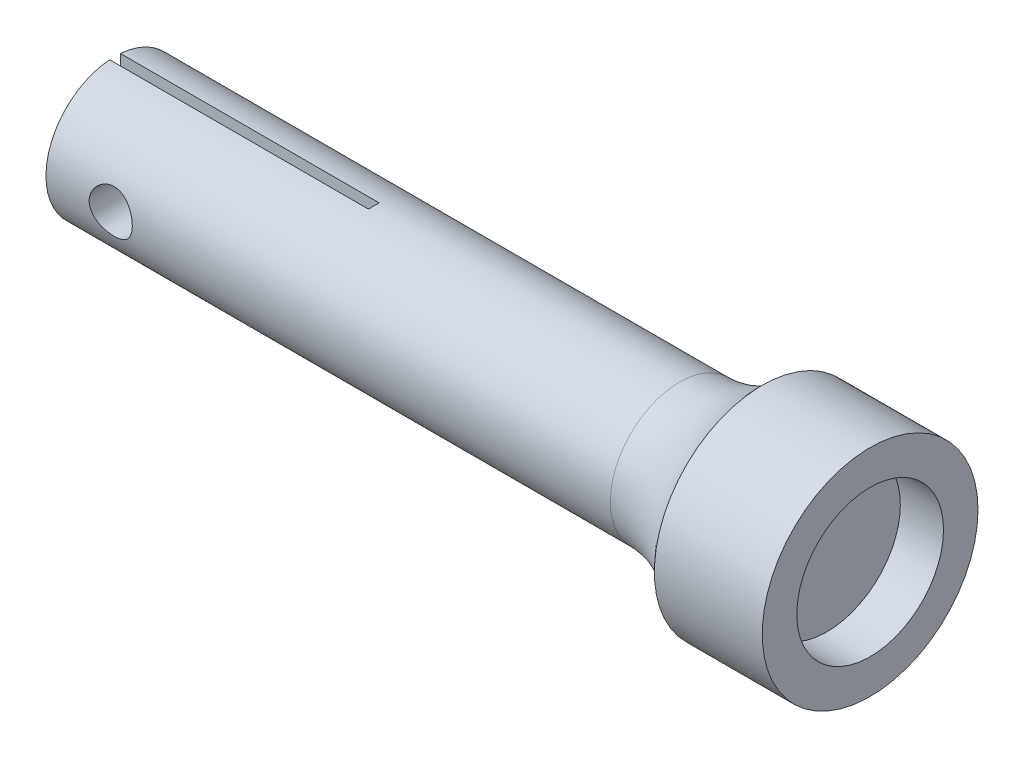
ISO-10303-21;
HEADER;
FILE_DESCRIPTION(('STEP AP214'),'2;1');
FILE_NAME('part.step','',(''),(''),'','','');
FILE_SCHEMA(('AUTOMOTIVE_DESIGN { 1 0 10303 214 1 1 1 1 }'));
ENDSEC;
DATA;
#1=APPLICATION_CONTEXT('core data for automotive mechanical design processes');
#2=APPLICATION_PROTOCOL_DEFINITION('international standard','automotive_design',2000,#1);
#3=PRODUCT_CONTEXT('',#1,'mechanical');
#4=PRODUCT('Part','Part','',(#3));
#5=PRODUCT_RELATED_PRODUCT_CATEGORY('part','',(#4));
#6=PRODUCT_DEFINITION_FORMATION('','',#4);
#7=PRODUCT_DEFINITION_CONTEXT('part definition',#1,'design');
#8=PRODUCT_DEFINITION('design','',#6,#7);
#9=PRODUCT_DEFINITION_SHAPE('','',#8);
#10=(LENGTH_UNIT() NAMED_UNIT(*) SI_UNIT(.MILLI.,.METRE.));
#11=(NAMED_UNIT(*) PLANE_ANGLE_UNIT() SI_UNIT($,.RADIAN.));
#12=(NAMED_UNIT(*) SI_UNIT($,.STERADIAN.) SOLID_ANGLE_UNIT());
#13=UNCERTAINTY_MEASURE_WITH_UNIT(LENGTH_MEASURE(1.E-05),#10,'distance_accuracy_value','');
#14=(GEOMETRIC_REPRESENTATION_CONTEXT(3) GLOBAL_UNCERTAINTY_ASSIGNED_CONTEXT((#13)) GLOBAL_UNIT_ASSIGNED_CONTEXT((#10,
#11,#12)) REPRESENTATION_CONTEXT('',''));
#15=CARTESIAN_POINT('',(0.,0.,0.));
#16=DIRECTION('',(0.,0.,1.));
#17=DIRECTION('',(1.,0.,0.));
#18=AXIS2_PLACEMENT_3D('',#15,#16,#17);
#19=CARTESIAN_POINT('',(30.,0.,0.));
#20=DIRECTION('',(-1.,0.,0.));
#21=DIRECTION('',(0.,0.,1.));
#22=AXIS2_PLACEMENT_3D('',#19,#20,#21);
#23=CYLINDRICAL_SURFACE('',#22,3.2);
#24=CARTESIAN_POINT('',(26.1581254575403,0.,0.));
#25=DIRECTION('',(1.,0.,0.));
#26=DIRECTION('',(0.,0.,-1.));
#27=AXIS2_PLACEMENT_3D('',#24,#25,#26);
#28=CIRCLE('',#27,3.2);
#29=CARTESIAN_POINT('',(26.1581254575403,0.,-3.2));
#30=VERTEX_POINT('',#29);
#31=EDGE_CURVE('E11',#30,#30,#28,.F.);
#32=ORIENTED_EDGE('',*,*,#31,.T.);
#33=EDGE_LOOP('',(#32));
#34=FACE_BOUND('',#33,.T.);
#35=CARTESIAN_POINT('',(0.,0.,0.));
#36=DIRECTION('',(1.,0.,0.));
#37=DIRECTION('',(0.,0.,-1.));
#38=AXIS2_PLACEMENT_3D('',#35,#36,#37);
#39=CIRCLE('',#38,3.2);
#40=CARTESIAN_POINT('',(0.,3.19021942818985,0.25));
#41=VERTEX_POINT('',#40);
#42=CARTESIAN_POINT('',(0.,3.19021942818985,-0.25));
#43=VERTEX_POINT('',#42);
#44=EDGE_CURVE('E106',#41,#43,#39,.T.);
#45=ORIENTED_EDGE('',*,*,#44,.T.);
#46=DIRECTION('',(-1.,0.,0.));
#47=VECTOR('',#46,1.);
#48=CARTESIAN_POINT('',(30.,3.19021942818985,-0.25));
#49=LINE('',#48,#47);
#50=CARTESIAN_POINT('',(12.,3.19021942818985,-0.25));
#51=VERTEX_POINT('',#50);
#52=EDGE_CURVE('E104',#43,#51,#49,.F.);
#53=ORIENTED_EDGE('',*,*,#52,.T.);
#54=CARTESIAN_POINT('',(12.,0.,0.));
#55=DIRECTION('',(-1.,0.,0.));
#56=DIRECTION('',(0.,0.,1.));
#57=AXIS2_PLACEMENT_3D('',#54,#55,#56);
#58=CIRCLE('',#57,3.2);
#59=CARTESIAN_POINT('',(12.,3.19021942818985,0.25));
#60=VERTEX_POINT('',#59);
#61=EDGE_CURVE('E43',#60,#51,#58,.T.);
#62=ORIENTED_EDGE('',*,*,#61,.F.);
#63=DIRECTION('',(-1.,0.,0.));
#64=VECTOR('',#63,1.);
#65=CARTESIAN_POINT('',(30.,3.19021942818985,0.25));
#66=LINE('',#65,#64);
#67=EDGE_CURVE('E100',#60,#41,#66,.T.);
#68=ORIENTED_EDGE('',*,*,#67,.T.);
#69=EDGE_LOOP('',(#45,#53,#62,#68));
#70=FACE_BOUND('',#69,.T.);
#71=CARTESIAN_POINT('',(3.,-1.00489028590507,-3.03812368301451));
#72=CARTESIAN_POINT('',(2.94534005810081,-1.00488991803513,-3.03812401968839));
#73=CARTESIAN_POINT('',(2.89067637379503,-1.00039346811909,-3.0396221875832));
#74=CARTESIAN_POINT('',(2.78295549531776,-0.982578387898462,-3.04542691988149));
#75=CARTESIAN_POINT('',(2.72989874090641,-0.969257365028304,-3.04973424591409));
#76=CARTESIAN_POINT('',(2.62696820067446,-0.934297183580995,-3.06062417992715));
#77=CARTESIAN_POINT('',(2.57708891992011,-0.912672866100785,-3.06720272628218));
#78=CARTESIAN_POINT('',(2.48165274255337,-0.861769923412997,-3.0818909294011));
#79=CARTESIAN_POINT('',(2.43609661598875,-0.832489938039375,-3.09000085817121));
#80=CARTESIAN_POINT('',(2.349020588023,-0.766020519771717,-3.10715697953857));
#81=CARTESIAN_POINT('',(2.30767256317931,-0.728611403293783,-3.11622458852111));
#82=CARTESIAN_POINT('',(2.23172171805359,-0.647416193933305,-3.13409924717697));
#83=CARTESIAN_POINT('',(2.19711985777421,-0.603629195002589,-3.14290625961547));
#84=CARTESIAN_POINT('',(2.13487535549621,-0.509673747487396,-3.15951847793756));
#85=CARTESIAN_POINT('',(2.10741170415257,-0.459381370383996,-3.16729588063273));
#86=CARTESIAN_POINT('',(2.06140020036631,-0.354606985481308,-3.18072924215363));
#87=CARTESIAN_POINT('',(2.04285026133559,-0.30012596165885,-3.18638569739834));
#88=CARTESIAN_POINT('',(2.0157628486828,-0.190300087176837,-3.19479642660639));
#89=CARTESIAN_POINT('',(2.00693466037393,-0.13503349099603,-3.19763470107392));
#90=CARTESIAN_POINT('',(1.99862241783519,-0.023735108659358,-3.20039566248745));
#91=CARTESIAN_POINT('',(1.99913621636364,0.0322964987012807,-3.20031901941845));
#92=CARTESIAN_POINT('',(2.00930235369397,0.141462425758228,-3.19732205787266));
#93=CARTESIAN_POINT('',(2.01863549444926,0.194629653737985,-3.19450096434891));
#94=CARTESIAN_POINT('',(2.04565357033199,0.29860386507745,-3.18646453441712));
#95=CARTESIAN_POINT('',(2.06333903395036,0.349410698860391,-3.18124904650501));
#96=CARTESIAN_POINT('',(2.10675418495462,0.447928045133885,-3.16888885155959));
#97=CARTESIAN_POINT('',(2.13257649935862,0.495594852212434,-3.16172206623181));
#98=CARTESIAN_POINT('',(2.1914579467374,0.586017934456484,-3.14621846785643));
#99=CARTESIAN_POINT('',(2.22451889779441,0.628772971843375,-3.13788136105575));
#100=CARTESIAN_POINT('',(2.29855297932154,0.7100339649576,-3.12052091038323));
#101=CARTESIAN_POINT('',(2.33979750051814,0.748289987399799,-3.11148344622698));
#102=CARTESIAN_POINT('',(2.42819797591376,0.817418207483272,-3.09404294960848));
#103=CARTESIAN_POINT('',(2.4753546294549,0.848289530335092,-3.08563999239034));
#104=CARTESIAN_POINT('',(2.57496075714845,0.902071800410989,-3.07035183596611));
#105=CARTESIAN_POINT('',(2.62746449341008,0.92488787958397,-3.06348505250416));
#106=CARTESIAN_POINT('',(2.73583330001767,0.961277302586408,-3.05226354552554));
#107=CARTESIAN_POINT('',(2.79169717039573,0.974853924921922,-3.0479079310358));
#108=CARTESIAN_POINT('',(2.90282536538657,0.991900011538335,-3.04240232704506));
#109=CARTESIAN_POINT('',(2.95802552120756,0.995749153710467,-3.04113199554655));
#110=CARTESIAN_POINT('',(3.06828689240323,0.994297181287794,-3.04160715788275));
#111=CARTESIAN_POINT('',(3.12334812780785,0.98899747140946,-3.04335218873821));
#112=CARTESIAN_POINT('',(3.23012561128353,0.969738837499926,-3.04954140502798));
#113=CARTESIAN_POINT('',(3.28189250568848,0.956032729704449,-3.05390670876319));
#114=CARTESIAN_POINT('',(3.38238627548872,0.920647326557825,-3.06475915638137));
#115=CARTESIAN_POINT('',(3.43111265595194,0.898966737067385,-3.07124664464428));
#116=CARTESIAN_POINT('',(3.52567443683353,0.847544452471734,-3.08583862930522));
#117=CARTESIAN_POINT('',(3.57138836384852,0.81759122561266,-3.09398383136777));
#118=CARTESIAN_POINT('',(3.65728025045478,0.750719909974853,-3.1108852390542));
#119=CARTESIAN_POINT('',(3.69745677949646,0.713800027221712,-3.11964160169048));
#120=CARTESIAN_POINT('',(3.77283116584864,0.632243224409876,-3.13720825236517));
#121=CARTESIAN_POINT('',(3.8077576072789,0.587352107872025,-3.14600605167389));
#122=CARTESIAN_POINT('',(3.86959207358974,0.492132232165323,-3.16229907413431));
#123=CARTESIAN_POINT('',(3.89650048548612,0.441803735608821,-3.16979436014868));
#124=CARTESIAN_POINT('',(3.94127092569439,0.337463502577018,-3.18258651472701));
#125=CARTESIAN_POINT('',(3.95920073358947,0.28348296535724,-3.18789979861803));
#126=CARTESIAN_POINT('',(3.98567071324002,0.17307867274324,-3.19579438845306));
#127=CARTESIAN_POINT('',(3.99421381031905,0.116655684228153,-3.1983765455303));
#128=CARTESIAN_POINT('',(4.00143214957138,0.0054829345845936,-3.20045831122552));
#129=CARTESIAN_POINT('',(4.00050182124959,-0.0492392135114147,-3.20008128163424));
#130=CARTESIAN_POINT('',(3.98975569354854,-0.15770886282271,-3.19657194437457));
#131=CARTESIAN_POINT('',(3.97994045380817,-0.211456425207278,-3.19343981024385));
#132=CARTESIAN_POINT('',(3.95195097300318,-0.315814162934153,-3.18480336932996));
#133=CARTESIAN_POINT('',(3.93387934036665,-0.366454437346073,-3.17932823223203));
#134=CARTESIAN_POINT('',(3.88998549004279,-0.464006998664252,-3.16656286395652));
#135=CARTESIAN_POINT('',(3.86416193043871,-0.510918638336132,-3.15927231855542));
#136=CARTESIAN_POINT('',(3.80447491692638,-0.601429121787465,-3.14332119295858));
#137=CARTESIAN_POINT('',(3.7703665337492,-0.644859622325118,-3.13462226139485));
#138=CARTESIAN_POINT('',(3.69550988388049,-0.725511383452271,-3.1169442069847));
#139=CARTESIAN_POINT('',(3.65475962221535,-0.762730771635391,-3.10796500061132));
#140=CARTESIAN_POINT('',(3.566157080033,-0.831147549552875,-3.09038585957023));
#141=CARTESIAN_POINT('',(3.51811427951425,-0.862104660577818,-3.08180833631386));
#142=CARTESIAN_POINT('',(3.41724774758587,-0.915470548778919,-3.06638053338758));
#143=CARTESIAN_POINT('',(3.36442598051087,-0.93788281863157,-3.05952954838969));
#144=CARTESIAN_POINT('',(3.26016213622354,-0.97187504435803,-3.04889310277102));
#145=CARTESIAN_POINT('',(3.20899039963516,-0.984219297297784,-3.04489508829884));
#146=CARTESIAN_POINT('',(3.10521335771809,-1.00072607765814,-3.03951054115273));
#147=CARTESIAN_POINT('',(3.05260841223605,-1.0048906399679,-3.03812335897686));
#148=CARTESIAN_POINT('',(3.,-1.00489028590507,-3.03812368301451));
#149=B_SPLINE_CURVE_WITH_KNOTS('',3,(#71,#72,#73,#74,#75,#76,#77,#78,#79,#80,#81,#82,#83,#84,
#85,#86,#87,#88,#89,#90,#91,#92,#93,#94,#95,#96,#97,#98,#99,#100,#101,#102,#103,#104,#105,#106,
#107,#108,#109,#110,#111,#112,#113,#114,#115,#116,#117,#118,#119,#120,#121,#122,#123,#124,#125,
#126,#127,#128,#129,#130,#131,#132,#133,#134,#135,#136,#137,#138,#139,#140,#141,#142,#143,#144,
#145,#146,#147,#148),.UNSPECIFIED.,.T.,.F.,(4,2,2,2,2,2,2,2,2,2,2,2,2,2,2,2,2,2,2,2,2,2,2,2,2,2,
2,2,2,2,2,2,2,2,2,2,2,2,4),(0.,0.163785421451001,0.327615267468598,0.49115364110366,
0.65472109001662,0.823429833968819,0.992162568266526,1.16478846998576,1.33737394244013,
1.50464518392591,1.67187797885331,1.83328096281806,1.99469416088083,2.15801558406783,
2.32137807480816,2.49151930301317,2.66168067613066,2.83378400460706,3.00582623247713,
3.17104178122699,3.33623196500645,3.49668245345444,3.65715899211751,3.82219501599903,
3.98727359623016,4.1591154808657,4.33094906965958,4.50146515630406,4.67192808733943,
4.8353237510604,4.99870912360333,5.16011701118317,5.3215528558082,5.48851415954316,
5.65552570498281,5.8280687297454,6.00054115229346,6.1582185121498,6.31585664110795),.UNSPECIFIED.);
#150=CARTESIAN_POINT('',(3.,-1.00489028590507,-3.03812368301451));
#151=VERTEX_POINT('',#150);
#152=EDGE_CURVE('E117',#151,#151,#149,.T.);
#153=ORIENTED_EDGE('',*,*,#152,.F.);
#154=EDGE_LOOP('',(#153));
#155=FACE_BOUND('',#154,.T.);
#156=CARTESIAN_POINT('',(3.99998804248039,0.,3.2));
#157=CARTESIAN_POINT('',(3.9997198754088,0.0547621550882232,3.19999972746085));
#158=CARTESIAN_POINT('',(3.99493918955931,0.10950601886136,3.19858100430801));
#159=CARTESIAN_POINT('',(3.97652641881088,0.217348754607882,3.19306713672272));
#160=CARTESIAN_POINT('',(3.96289229501671,0.270447244709387,3.18897137578262));
#161=CARTESIAN_POINT('',(3.92727483689011,0.373429752998777,3.17855737645815));
#162=CARTESIAN_POINT('',(3.90530446785552,0.423318622874415,3.17224259042735));
#163=CARTESIAN_POINT('',(3.85369079286073,0.518707336735358,3.15804864241927));
#164=CARTESIAN_POINT('',(3.82404628362585,0.564206490893583,3.15016923516078));
#165=CARTESIAN_POINT('',(3.75696120450327,0.650928274201503,3.13341645159743));
#166=CARTESIAN_POINT('',(3.71932664397773,0.691996663441782,3.12452151705159));
#167=CARTESIAN_POINT('',(3.63775062866808,0.767352192792544,3.10687486875508));
#168=CARTESIAN_POINT('',(3.59380803128563,0.801638101685609,3.09812318127191));
#169=CARTESIAN_POINT('',(3.49956125863824,0.863259008209843,3.08153039651113));
#170=CARTESIAN_POINT('',(3.4491291914474,0.890406372065711,3.07371635899891));
#171=CARTESIAN_POINT('',(3.34413156254115,0.935769857726827,3.06021226635269));
#172=CARTESIAN_POINT('',(3.28956710487276,0.953988355398672,3.05452164629848));
#173=CARTESIAN_POINT('',(3.17960237239589,0.980423207372774,3.04613831543511));
#174=CARTESIAN_POINT('',(3.12427778301417,0.988926469257728,3.04335982286724));
#175=CARTESIAN_POINT('',(3.01292312892222,0.996581386863578,3.04086227633628));
#176=CARTESIAN_POINT('',(2.95689324966504,0.995735451648299,3.04114243423211));
#177=CARTESIAN_POINT('',(2.84801678885275,0.984947346340263,3.04465216722755));
#178=CARTESIAN_POINT('',(2.79513091850277,0.975358383540308,3.04776720751491));
#179=CARTESIAN_POINT('',(2.69175773575075,0.947919954011564,3.05641172519098));
#180=CARTESIAN_POINT('',(2.64127068671895,0.930069582550295,3.0619414670174));
#181=CARTESIAN_POINT('',(2.5432289642319,0.886337095957695,3.0748872589433));
#182=CARTESIAN_POINT('',(2.49573127012277,0.860335780165213,3.08233098831699));
#183=CARTESIAN_POINT('',(2.40565332820504,0.80112396587633,3.09824758585754));
#184=CARTESIAN_POINT('',(2.36307435729652,0.767911601807049,3.1067207200918));
#185=CARTESIAN_POINT('',(2.28203244520438,0.693453709257907,3.12420328687166));
#186=CARTESIAN_POINT('',(2.24384067150482,0.651914118816035,3.13321970260108));
#187=CARTESIAN_POINT('',(2.17490318532398,0.562898715238769,3.15042810564076));
#188=CARTESIAN_POINT('',(2.1441579526984,0.515422519846829,3.1586200398015));
#189=CARTESIAN_POINT('',(2.0908425182369,0.415422647909625,3.17332494862608));
#190=CARTESIAN_POINT('',(2.06832703135378,0.362868024901135,3.17982660600056));
#191=CARTESIAN_POINT('',(2.03253492823346,0.254467584628426,3.19033012276537));
#192=CARTESIAN_POINT('',(2.01925549243715,0.198622777435572,3.19433274501682));
#193=CARTESIAN_POINT('',(2.00276298385102,0.0875594846025095,3.19926596791371));
#194=CARTESIAN_POINT('',(1.99917857791619,0.0324010766823027,3.20030996638896));
#195=CARTESIAN_POINT('',(2.0011373317665,-0.0777279447917516,3.1995295218621));
#196=CARTESIAN_POINT('',(2.00667922490708,-0.132698583345168,3.19770547691904));
#197=CARTESIAN_POINT('',(2.02643746923565,-0.239534335805303,3.19146067796341));
#198=CARTESIAN_POINT('',(2.04044420943436,-0.291442224709498,3.1871027647646));
#199=CARTESIAN_POINT('',(2.07648152681062,-0.392156807422591,3.17628409792391));
#200=CARTESIAN_POINT('',(2.09851313499917,-0.440963101801203,3.16982307409204));
#201=CARTESIAN_POINT('',(2.15060272988427,-0.535464558628908,3.15525325438532));
#202=CARTESIAN_POINT('',(2.18085033149604,-0.581049243791103,3.14710678136312));
#203=CARTESIAN_POINT('',(2.24827977764668,-0.666619766791264,3.13009976629693));
#204=CARTESIAN_POINT('',(2.28546351447536,-0.706604071530521,3.12123902976582));
#205=CARTESIAN_POINT('',(2.36744995315599,-0.781473634298777,3.10335952169391));
#206=CARTESIAN_POINT('',(2.41249529817144,-0.816095605661777,3.09434829920868));
#207=CARTESIAN_POINT('',(2.50796121456449,-0.877307803704751,3.07755455918461));
#208=CARTESIAN_POINT('',(2.55838164316557,-0.903898243651673,3.06977200902258));
#209=CARTESIAN_POINT('',(2.66299293451114,-0.948093648906736,3.05641163239125));
#210=CARTESIAN_POINT('',(2.71716299543048,-0.965744279217157,3.05082263482649));
#211=CARTESIAN_POINT('',(2.82791679347776,-0.991611093124386,3.0425147072741));
#212=CARTESIAN_POINT('',(2.88449959551435,-0.999830897912905,3.03979467571054));
#213=CARTESIAN_POINT('',(2.99568575090946,-1.00635924040334,3.03763909664289));
#214=CARTESIAN_POINT('',(3.05026101473616,-1.00510463750927,3.03805877054374));
#215=CARTESIAN_POINT('',(3.15838052032232,-0.993763340596067,3.04178718337116));
#216=CARTESIAN_POINT('',(3.21192480410831,-0.983677007372979,3.04509580427772));
#217=CARTESIAN_POINT('',(3.31574118210636,-0.955240450838507,3.05413359151001));
#218=CARTESIAN_POINT('',(3.3660482665651,-0.937006337728378,3.05982868079059));
#219=CARTESIAN_POINT('',(3.46293205462198,-0.892881820923539,3.0729936163064));
#220=CARTESIAN_POINT('',(3.5095079845432,-0.866989834519054,3.08046382935689));
#221=CARTESIAN_POINT('',(3.59961988016584,-0.807074326876953,3.09671274640644));
#222=CARTESIAN_POINT('',(3.64296000767961,-0.772767224004869,3.10553180806652));
#223=CARTESIAN_POINT('',(3.72340788763895,-0.697505995924301,3.12329606381794));
#224=CARTESIAN_POINT('',(3.76051396854674,-0.656550093739927,3.13224129104341));
#225=CARTESIAN_POINT('',(3.82864415759471,-0.567553166356906,3.14960342995769));
#226=CARTESIAN_POINT('',(3.85943168554171,-0.5193252787521,3.1579937592107));
#227=CARTESIAN_POINT('',(3.91241778504249,-0.418113342022692,3.17297842825248));
#228=CARTESIAN_POINT('',(3.9346197860712,-0.365131202417626,3.1795734848477));
#229=CARTESIAN_POINT('',(3.96817728121897,-0.260593505475083,3.18976638165711));
#230=CARTESIAN_POINT('',(3.98029764475819,-0.209303066419258,3.19357221806656));
#231=CARTESIAN_POINT('',(3.99633113762075,-0.105335926905313,3.19868890807814));
#232=CARTESIAN_POINT('',(4.0002459130054,-0.0526595066256789,3.20000026207473));
#233=CARTESIAN_POINT('',(3.99998804248039,0.,3.2));
#234=B_SPLINE_CURVE_WITH_KNOTS('',3,(#156,#157,#158,#159,#160,#161,#162,#163,#164,#165,#166,
#167,#168,#169,#170,#171,#172,#173,#174,#175,#176,#177,#178,#179,#180,#181,#182,#183,#184,#185,
#186,#187,#188,#189,#190,#191,#192,#193,#194,#195,#196,#197,#198,#199,#200,#201,#202,#203,#204,
#205,#206,#207,#208,#209,#210,#211,#212,#213,#214,#215,#216,#217,#218,#219,#220,#221,#222,#223,
#224,#225,#226,#227,#228,#229,#230,#231,#232,#233),.UNSPECIFIED.,.T.,.F.,(4,2,2,2,2,2,2,2,2,2,2,
2,2,2,2,2,2,2,2,2,2,2,2,2,2,2,2,2,2,2,2,2,2,2,2,2,2,2,4),(0.,0.164094784215281,
0.328227371913011,0.492105724941424,0.656009789023978,0.824474935355684,0.992970635004199,
1.1655310605211,1.33804554476913,1.5053218097828,1.67255497272077,1.83331774455553,
1.99409812618736,2.15734905077832,2.32064226050667,2.49127798769931,2.66192470774806,
2.83368616865666,3.00539517160384,3.17042761780431,3.33543716098263,3.49651911265358,
3.65762176695497,3.8228154680601,3.9880543027651,4.15980983944321,4.33156081497379,
4.50242539893045,4.67322435335107,4.83619762793514,4.99916424500511,5.15987910548974,
5.32062720535195,5.48779853062004,5.65501460832201,5.82765975023431,6.00023585790981,
6.1580617198155,6.31585591843136),.UNSPECIFIED.);
#235=CARTESIAN_POINT('',(3.99998804248039,0.,3.2));
#236=VERTEX_POINT('',#235);
#237=EDGE_CURVE('E98',#236,#236,#234,.T.);
#238=ORIENTED_EDGE('',*,*,#237,.F.);
#239=EDGE_LOOP('',(#238));
#240=FACE_BOUND('',#239,.T.);
#241=ADVANCED_FACE('F35',(#34,#70,#155,#240),#23,.T.);
#242=CARTESIAN_POINT('',(0.,0.,0.));
#243=DIRECTION('',(1.,0.,0.));
#244=DIRECTION('',(0.,0.,-1.));
#245=AXIS2_PLACEMENT_3D('',#242,#243,#244);
#246=PLANE('',#245);
#247=DIRECTION('',(0.,0.,1.));
#248=VECTOR('',#247,1.);
#249=CARTESIAN_POINT('',(0.,-2.59236932889197,-0.25));
#250=LINE('',#249,#248);
#251=CARTESIAN_POINT('',(0.,-2.59236932889197,-0.25));
#252=VERTEX_POINT('',#251);
#253=CARTESIAN_POINT('',(0.,-2.59236932889197,0.25));
#254=VERTEX_POINT('',#253);
#255=EDGE_CURVE('E96',#252,#254,#250,.T.);
#256=ORIENTED_EDGE('',*,*,#255,.F.);
#257=DIRECTION('',(0.,1.,0.));
#258=VECTOR('',#257,1.);
#259=CARTESIAN_POINT('',(0.,0.,-0.25));
#260=LINE('',#259,#258);
#261=EDGE_CURVE('E85',#252,#43,#260,.T.);
#262=ORIENTED_EDGE('',*,*,#261,.T.);
#263=ORIENTED_EDGE('',*,*,#44,.F.);
#264=DIRECTION('',(0.,1.,0.));
#265=VECTOR('',#264,1.);
#266=CARTESIAN_POINT('',(0.,3.86196678721204,0.25));
#267=LINE('',#266,#265);
#268=EDGE_CURVE('E81',#254,#41,#267,.T.);
#269=ORIENTED_EDGE('',*,*,#268,.F.);
#270=EDGE_LOOP('',(#256,#262,#263,#269));
#271=FACE_BOUND('',#270,.T.);
#272=ADVANCED_FACE('F152',(#271),#246,.F.);
#273=CARTESIAN_POINT('',(12.,0.,0.));
#274=DIRECTION('',(-1.,0.,0.));
#275=DIRECTION('',(0.,0.,1.));
#276=AXIS2_PLACEMENT_3D('',#273,#274,#275);
#277=PLANE('',#276);
#278=ORIENTED_EDGE('',*,*,#61,.T.);
#279=DIRECTION('',(0.,-1.,0.));
#280=VECTOR('',#279,1.);
#281=CARTESIAN_POINT('',(12.,3.86196678721204,-0.25));
#282=LINE('',#281,#280);
#283=CARTESIAN_POINT('',(12.,-2.59236932889197,-0.25));
#284=VERTEX_POINT('',#283);
#285=EDGE_CURVE('E76',#51,#284,#282,.T.);
#286=ORIENTED_EDGE('',*,*,#285,.T.);
#287=DIRECTION('',(0.,0.,1.));
#288=VECTOR('',#287,1.);
#289=CARTESIAN_POINT('',(12.,-2.59236932889197,-0.25));
#290=LINE('',#289,#288);
#291=CARTESIAN_POINT('',(12.,-2.59236932889197,0.25));
#292=VERTEX_POINT('',#291);
#293=EDGE_CURVE('E78',#284,#292,#290,.T.);
#294=ORIENTED_EDGE('',*,*,#293,.T.);
#295=DIRECTION('',(0.,1.,0.));
#296=VECTOR('',#295,1.);
#297=CARTESIAN_POINT('',(12.,3.86196678721204,0.25));
#298=LINE('',#297,#296);
#299=EDGE_CURVE('E88',#292,#60,#298,.T.);
#300=ORIENTED_EDGE('',*,*,#299,.T.);
#301=EDGE_LOOP('',(#278,#286,#294,#300));
#302=FACE_BOUND('',#301,.T.);
#303=ADVANCED_FACE('F77',(#302),#277,.T.);
#304=CARTESIAN_POINT('',(12.,3.86196678721204,-0.25));
#305=DIRECTION('',(0.,0.,-1.));
#306=DIRECTION('',(-1.,0.,0.));
#307=AXIS2_PLACEMENT_3D('',#304,#305,#306);
#308=PLANE('',#307);
#309=CARTESIAN_POINT('',(3.,-0.00489028590507356,-0.25));
#310=DIRECTION('',(0.,0.,-1.));
#311=DIRECTION('',(-1.,0.,0.));
#312=AXIS2_PLACEMENT_3D('',#309,#310,#311);
#313=CIRCLE('',#312,1.);
#314=CARTESIAN_POINT('',(2.,-0.00489028590507356,-0.25));
#315=VERTEX_POINT('',#314);
#316=EDGE_CURVE('E112',#315,#315,#313,.F.);
#317=ORIENTED_EDGE('',*,*,#316,.F.);
#318=EDGE_LOOP('',(#317));
#319=FACE_BOUND('',#318,.T.);
#320=ORIENTED_EDGE('',*,*,#261,.F.);
#321=DIRECTION('',(-1.,0.,0.));
#322=VECTOR('',#321,1.);
#323=CARTESIAN_POINT('',(12.,-2.59236932889197,-0.25));
#324=LINE('',#323,#322);
#325=EDGE_CURVE('E50',#284,#252,#324,.T.);
#326=ORIENTED_EDGE('',*,*,#325,.F.);
#327=ORIENTED_EDGE('',*,*,#285,.F.);
#328=ORIENTED_EDGE('',*,*,#52,.F.);
#329=EDGE_LOOP('',(#320,#326,#327,#328));
#330=FACE_BOUND('',#329,.T.);
#331=ADVANCED_FACE('F83',(#319,#330),#308,.F.);
#332=CARTESIAN_POINT('',(12.,3.86196678721204,0.25));
#333=DIRECTION('',(0.,0.,1.));
#334=DIRECTION('',(1.,0.,0.));
#335=AXIS2_PLACEMENT_3D('',#332,#333,#334);
#336=PLANE('',#335);
#337=CARTESIAN_POINT('',(3.,-0.0048902859050735,0.25));
#338=DIRECTION('',(0.,0.,1.));
#339=DIRECTION('',(1.,0.,0.));
#340=AXIS2_PLACEMENT_3D('',#337,#338,#339);
#341=CIRCLE('',#340,1.);
#342=CARTESIAN_POINT('',(4.,-0.0048902859050735,0.25));
#343=VERTEX_POINT('',#342);
#344=EDGE_CURVE('E110',#343,#343,#341,.F.);
#345=ORIENTED_EDGE('',*,*,#344,.F.);
#346=EDGE_LOOP('',(#345));
#347=FACE_BOUND('',#346,.T.);
#348=ORIENTED_EDGE('',*,*,#299,.F.);
#349=DIRECTION('',(-1.,0.,0.));
#350=VECTOR('',#349,1.);
#351=CARTESIAN_POINT('',(12.,-2.59236932889197,0.25));
#352=LINE('',#351,#350);
#353=EDGE_CURVE('E87',#292,#254,#352,.T.);
#354=ORIENTED_EDGE('',*,*,#353,.T.);
#355=ORIENTED_EDGE('',*,*,#268,.T.);
#356=ORIENTED_EDGE('',*,*,#67,.F.);
#357=EDGE_LOOP('',(#348,#354,#355,#356));
#358=FACE_BOUND('',#357,.T.);
#359=ADVANCED_FACE('F153',(#347,#358),#336,.F.);
#360=CARTESIAN_POINT('',(12.,-2.59236932889197,-0.25));
#361=DIRECTION('',(0.,-1.,0.));
#362=DIRECTION('',(0.,0.,-1.));
#363=AXIS2_PLACEMENT_3D('',#360,#361,#362);
#364=PLANE('',#363);
#365=ORIENTED_EDGE('',*,*,#255,.T.);
#366=ORIENTED_EDGE('',*,*,#353,.F.);
#367=ORIENTED_EDGE('',*,*,#293,.F.);
#368=ORIENTED_EDGE('',*,*,#325,.T.);
#369=EDGE_LOOP('',(#365,#366,#367,#368));
#370=FACE_BOUND('',#369,.T.);
#371=ADVANCED_FACE('F90',(#370),#364,.F.);
#372=CARTESIAN_POINT('',(3.,-0.0048902859050747,-9.75));
#373=DIRECTION('',(0.,0.,1.));
#374=DIRECTION('',(0.,-1.,0.));
#375=AXIS2_PLACEMENT_3D('',#372,#373,#374);
#376=CYLINDRICAL_SURFACE('',#375,1.);
#377=ORIENTED_EDGE('',*,*,#344,.T.);
#378=EDGE_LOOP('',(#377));
#379=FACE_BOUND('',#378,.T.);
#380=ORIENTED_EDGE('',*,*,#237,.T.);
#381=EDGE_LOOP('',(#380));
#382=FACE_BOUND('',#381,.T.);
#383=ADVANCED_FACE('F141',(#379,#382),#376,.F.);
#384=ORIENTED_EDGE('',*,*,#316,.T.);
#385=EDGE_LOOP('',(#384));
#386=FACE_BOUND('',#385,.T.);
#387=ORIENTED_EDGE('',*,*,#152,.T.);
#388=EDGE_LOOP('',(#387));
#389=FACE_BOUND('',#388,.T.);
#390=ADVANCED_FACE('F146',(#386,#389),#376,.F.);
#391=CARTESIAN_POINT('',(35.,0.,0.));
#392=DIRECTION('',(-1.,0.,0.));
#393=DIRECTION('',(0.,0.,1.));
#394=AXIS2_PLACEMENT_3D('',#391,#392,#393);
#395=CYLINDRICAL_SURFACE('',#394,5.);
#396=CARTESIAN_POINT('',(35.,0.,0.));
#397=DIRECTION('',(1.,0.,0.));
#398=DIRECTION('',(0.,0.,-1.));
#399=AXIS2_PLACEMENT_3D('',#396,#397,#398);
#400=CIRCLE('',#399,5.);
#401=CARTESIAN_POINT('',(35.,0.,-5.));
#402=VERTEX_POINT('',#401);
#403=EDGE_CURVE('E113',#402,#402,#400,.T.);
#404=ORIENTED_EDGE('',*,*,#403,.F.);
#405=EDGE_LOOP('',(#404));
#406=FACE_BOUND('',#405,.T.);
#407=CARTESIAN_POINT('',(30.,0.,0.));
#408=DIRECTION('',(1.,0.,0.));
#409=DIRECTION('',(0.,0.,-1.));
#410=AXIS2_PLACEMENT_3D('',#407,#408,#409);
#411=CIRCLE('',#410,5.);
#412=CARTESIAN_POINT('',(30.,0.,-5.));
#413=VERTEX_POINT('',#412);
#414=EDGE_CURVE('E120',#413,#413,#411,.T.);
#415=ORIENTED_EDGE('',*,*,#414,.T.);
#416=EDGE_LOOP('',(#415));
#417=FACE_BOUND('',#416,.T.);
#418=ADVANCED_FACE('F147',(#406,#417),#395,.T.);
#419=CARTESIAN_POINT('',(35.,0.,0.));
#420=DIRECTION('',(1.,0.,0.));
#421=DIRECTION('',(0.,0.,-1.));
#422=AXIS2_PLACEMENT_3D('',#419,#420,#421);
#423=PLANE('',#422);
#424=CARTESIAN_POINT('',(35.,0.,0.));
#425=DIRECTION('',(1.,0.,0.));
#426=DIRECTION('',(0.,0.,-1.));
#427=AXIS2_PLACEMENT_3D('',#424,#425,#426);
#428=CIRCLE('',#427,3.4);
#429=CARTESIAN_POINT('',(35.,0.,-3.4));
#430=VERTEX_POINT('',#429);
#431=EDGE_CURVE('E128',#430,#430,#428,.T.);
#432=ORIENTED_EDGE('',*,*,#431,.F.);
#433=EDGE_LOOP('',(#432));
#434=FACE_BOUND('',#433,.T.);
#435=ORIENTED_EDGE('',*,*,#403,.T.);
#436=EDGE_LOOP('',(#435));
#437=FACE_BOUND('',#436,.T.);
#438=ADVANCED_FACE('F183',(#434,#437),#423,.T.);
#439=CARTESIAN_POINT('',(26.1581254575403,0.,0.));
#440=DIRECTION('',(1.,0.,0.));
#441=DIRECTION('',(0.,0.,-1.));
#442=AXIS2_PLACEMENT_3D('',#439,#440,#441);
#443=TOROIDAL_SURFACE('',#442,8.2,5.);
#444=ORIENTED_EDGE('',*,*,#31,.F.);
#445=EDGE_LOOP('',(#444));
#446=FACE_BOUND('',#445,.T.);
#447=ORIENTED_EDGE('',*,*,#414,.F.);
#448=EDGE_LOOP('',(#447));
#449=FACE_BOUND('',#448,.T.);
#450=ADVANCED_FACE('F37',(#446,#449),#443,.F.);
#451=CARTESIAN_POINT('',(33.,0.,0.));
#452=DIRECTION('',(1.,0.,0.));
#453=DIRECTION('',(0.,0.,-1.));
#454=AXIS2_PLACEMENT_3D('',#451,#452,#453);
#455=CYLINDRICAL_SURFACE('',#454,3.4);
#456=CARTESIAN_POINT('',(33.,0.,0.));
#457=DIRECTION('',(1.,0.,0.));
#458=DIRECTION('',(0.,0.,-1.));
#459=AXIS2_PLACEMENT_3D('',#456,#457,#458);
#460=CIRCLE('',#459,3.4);
#461=CARTESIAN_POINT('',(33.,0.,-3.4));
#462=VERTEX_POINT('',#461);
#463=EDGE_CURVE('E125',#462,#462,#460,.T.);
#464=ORIENTED_EDGE('',*,*,#463,.F.);
#465=EDGE_LOOP('',(#464));
#466=FACE_BOUND('',#465,.T.);
#467=ORIENTED_EDGE('',*,*,#431,.T.);
#468=EDGE_LOOP('',(#467));
#469=FACE_BOUND('',#468,.T.);
#470=ADVANCED_FACE('F194',(#466,#469),#455,.F.);
#471=CARTESIAN_POINT('',(33.,0.,0.));
#472=DIRECTION('',(1.,0.,0.));
#473=DIRECTION('',(0.,0.,-1.));
#474=AXIS2_PLACEMENT_3D('',#471,#472,#473);
#475=PLANE('',#474);
#476=ORIENTED_EDGE('',*,*,#463,.T.);
#477=EDGE_LOOP('',(#476));
#478=FACE_BOUND('',#477,.T.);
#479=ADVANCED_FACE('F199',(#478),#475,.T.);
#480=CLOSED_SHELL('',(#241,#272,#303,#331,#359,#371,#383,#390,#418,#438,#450,#470,#479));
#481=MANIFOLD_SOLID_BREP('B2',#480);
#482=ADVANCED_BREP_SHAPE_REPRESENTATION('',(#18,#481),#14);
#483=SHAPE_DEFINITION_REPRESENTATION(#9,#482);
ENDSEC;
END-ISO-10303-21;
